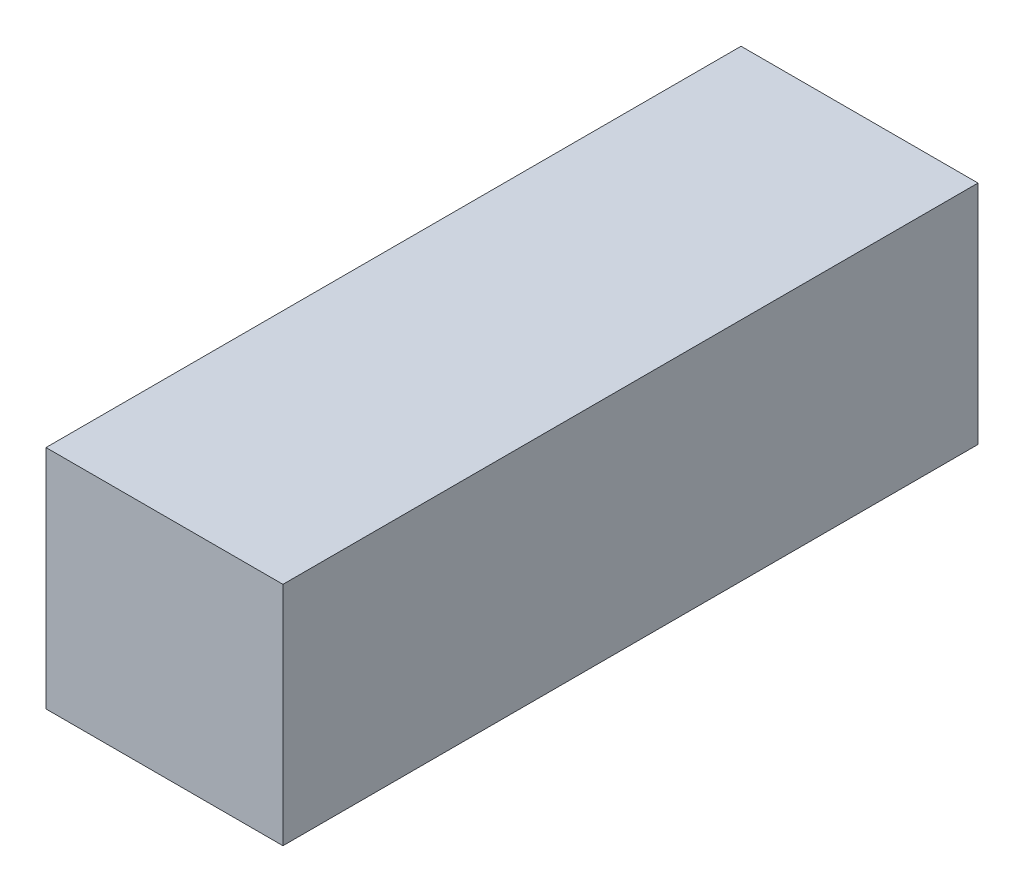
ISO-10303-21;
HEADER;
FILE_DESCRIPTION(('STEP AP214'),'2;1');
FILE_NAME('part.step','',(''),(''),'','','');
FILE_SCHEMA(('AUTOMOTIVE_DESIGN { 1 0 10303 214 1 1 1 1 }'));
ENDSEC;
DATA;
#1=APPLICATION_CONTEXT('core data for automotive mechanical design processes');
#2=APPLICATION_PROTOCOL_DEFINITION('international standard','automotive_design',2000,#1);
#3=PRODUCT_CONTEXT('',#1,'mechanical');
#4=PRODUCT('Part','Part','',(#3));
#5=PRODUCT_RELATED_PRODUCT_CATEGORY('part','',(#4));
#6=PRODUCT_DEFINITION_FORMATION('','',#4);
#7=PRODUCT_DEFINITION_CONTEXT('part definition',#1,'design');
#8=PRODUCT_DEFINITION('design','',#6,#7);
#9=PRODUCT_DEFINITION_SHAPE('','',#8);
#10=(LENGTH_UNIT() NAMED_UNIT(*) SI_UNIT(.MILLI.,.METRE.));
#11=(NAMED_UNIT(*) PLANE_ANGLE_UNIT() SI_UNIT($,.RADIAN.));
#12=(NAMED_UNIT(*) SI_UNIT($,.STERADIAN.) SOLID_ANGLE_UNIT());
#13=UNCERTAINTY_MEASURE_WITH_UNIT(LENGTH_MEASURE(1.E-05),#10,'distance_accuracy_value','');
#14=(GEOMETRIC_REPRESENTATION_CONTEXT(3) GLOBAL_UNCERTAINTY_ASSIGNED_CONTEXT((#13)) GLOBAL_UNIT_ASSIGNED_CONTEXT((#10,
#11,#12)) REPRESENTATION_CONTEXT('',''));
#15=CARTESIAN_POINT('',(0.,0.,0.));
#16=DIRECTION('',(0.,0.,1.));
#17=DIRECTION('',(1.,0.,0.));
#18=AXIS2_PLACEMENT_3D('',#15,#16,#17);
#19=CARTESIAN_POINT('',(-22.5,21.5,132.));
#20=DIRECTION('',(1.,0.,0.));
#21=DIRECTION('',(0.,1.,0.));
#22=AXIS2_PLACEMENT_3D('',#19,#20,#21);
#23=PLANE('',#22);
#24=DIRECTION('',(0.,-1.,0.));
#25=VECTOR('',#24,1.);
#26=CARTESIAN_POINT('',(-22.5,21.5,0.));
#27=LINE('',#26,#25);
#28=CARTESIAN_POINT('',(-22.5,21.5,0.));
#29=VERTEX_POINT('',#28);
#30=CARTESIAN_POINT('',(-22.5,-21.5,0.));
#31=VERTEX_POINT('',#30);
#32=EDGE_CURVE('E107',#29,#31,#27,.T.);
#33=ORIENTED_EDGE('',*,*,#32,.T.);
#34=DIRECTION('',(0.,0.,-1.));
#35=VECTOR('',#34,1.);
#36=CARTESIAN_POINT('',(-22.5,-21.5,132.));
#37=LINE('',#36,#35);
#38=CARTESIAN_POINT('',(-22.5,-21.5,132.));
#39=VERTEX_POINT('',#38);
#40=EDGE_CURVE('E11',#39,#31,#37,.T.);
#41=ORIENTED_EDGE('',*,*,#40,.F.);
#42=DIRECTION('',(0.,-1.,0.));
#43=VECTOR('',#42,1.);
#44=CARTESIAN_POINT('',(-22.5,21.5,132.));
#45=LINE('',#44,#43);
#46=CARTESIAN_POINT('',(-22.5,21.5,132.));
#47=VERTEX_POINT('',#46);
#48=EDGE_CURVE('E91',#47,#39,#45,.T.);
#49=ORIENTED_EDGE('',*,*,#48,.F.);
#50=DIRECTION('',(0.,0.,-1.));
#51=VECTOR('',#50,1.);
#52=CARTESIAN_POINT('',(-22.5,21.5,132.));
#53=LINE('',#52,#51);
#54=EDGE_CURVE('E103',#47,#29,#53,.T.);
#55=ORIENTED_EDGE('',*,*,#54,.T.);
#56=EDGE_LOOP('',(#33,#41,#49,#55));
#57=FACE_BOUND('',#56,.T.);
#58=ADVANCED_FACE('F39',(#57),#23,.F.);
#59=CARTESIAN_POINT('',(-22.5,-21.5,132.));
#60=DIRECTION('',(0.,1.,0.));
#61=DIRECTION('',(0.,0.,1.));
#62=AXIS2_PLACEMENT_3D('',#59,#60,#61);
#63=PLANE('',#62);
#64=DIRECTION('',(1.,0.,0.));
#65=VECTOR('',#64,1.);
#66=CARTESIAN_POINT('',(-22.5,-21.5,0.));
#67=LINE('',#66,#65);
#68=CARTESIAN_POINT('',(22.5,-21.5,0.));
#69=VERTEX_POINT('',#68);
#70=EDGE_CURVE('E96',#31,#69,#67,.T.);
#71=ORIENTED_EDGE('',*,*,#70,.T.);
#72=DIRECTION('',(0.,0.,-1.));
#73=VECTOR('',#72,1.);
#74=CARTESIAN_POINT('',(22.5,-21.5,132.));
#75=LINE('',#74,#73);
#76=CARTESIAN_POINT('',(22.5,-21.5,132.));
#77=VERTEX_POINT('',#76);
#78=EDGE_CURVE('E48',#77,#69,#75,.T.);
#79=ORIENTED_EDGE('',*,*,#78,.F.);
#80=DIRECTION('',(1.,0.,0.));
#81=VECTOR('',#80,1.);
#82=CARTESIAN_POINT('',(-22.5,-21.5,132.));
#83=LINE('',#82,#81);
#84=EDGE_CURVE('E86',#39,#77,#83,.T.);
#85=ORIENTED_EDGE('',*,*,#84,.F.);
#86=ORIENTED_EDGE('',*,*,#40,.T.);
#87=EDGE_LOOP('',(#71,#79,#85,#86));
#88=FACE_BOUND('',#87,.T.);
#89=ADVANCED_FACE('F95',(#88),#63,.F.);
#90=CARTESIAN_POINT('',(22.5,21.5,132.));
#91=DIRECTION('',(-1.,0.,0.));
#92=DIRECTION('',(0.,-1.,0.));
#93=AXIS2_PLACEMENT_3D('',#90,#91,#92);
#94=PLANE('',#93);
#95=DIRECTION('',(0.,1.,0.));
#96=VECTOR('',#95,1.);
#97=CARTESIAN_POINT('',(22.5,21.5,0.));
#98=LINE('',#97,#96);
#99=CARTESIAN_POINT('',(22.5,21.5,0.));
#100=VERTEX_POINT('',#99);
#101=EDGE_CURVE('E73',#69,#100,#98,.T.);
#102=ORIENTED_EDGE('',*,*,#101,.T.);
#103=DIRECTION('',(0.,0.,-1.));
#104=VECTOR('',#103,1.);
#105=CARTESIAN_POINT('',(22.5,21.5,132.));
#106=LINE('',#105,#104);
#107=CARTESIAN_POINT('',(22.5,21.5,132.));
#108=VERTEX_POINT('',#107);
#109=EDGE_CURVE('E98',#108,#100,#106,.T.);
#110=ORIENTED_EDGE('',*,*,#109,.F.);
#111=DIRECTION('',(0.,1.,0.));
#112=VECTOR('',#111,1.);
#113=CARTESIAN_POINT('',(22.5,21.5,132.));
#114=LINE('',#113,#112);
#115=EDGE_CURVE('E89',#77,#108,#114,.T.);
#116=ORIENTED_EDGE('',*,*,#115,.F.);
#117=ORIENTED_EDGE('',*,*,#78,.T.);
#118=EDGE_LOOP('',(#102,#110,#116,#117));
#119=FACE_BOUND('',#118,.T.);
#120=ADVANCED_FACE('F99',(#119),#94,.F.);
#121=CARTESIAN_POINT('',(-22.5,21.5,132.));
#122=DIRECTION('',(0.,-1.,0.));
#123=DIRECTION('',(1.,0.,0.));
#124=AXIS2_PLACEMENT_3D('',#121,#122,#123);
#125=PLANE('',#124);
#126=DIRECTION('',(-1.,0.,0.));
#127=VECTOR('',#126,1.);
#128=CARTESIAN_POINT('',(-22.5,21.5,0.));
#129=LINE('',#128,#127);
#130=EDGE_CURVE('E79',#100,#29,#129,.T.);
#131=ORIENTED_EDGE('',*,*,#130,.T.);
#132=ORIENTED_EDGE('',*,*,#54,.F.);
#133=DIRECTION('',(-1.,0.,0.));
#134=VECTOR('',#133,1.);
#135=CARTESIAN_POINT('',(-22.5,21.5,132.));
#136=LINE('',#135,#134);
#137=EDGE_CURVE('E56',#108,#47,#136,.T.);
#138=ORIENTED_EDGE('',*,*,#137,.F.);
#139=ORIENTED_EDGE('',*,*,#109,.T.);
#140=EDGE_LOOP('',(#131,#132,#138,#139));
#141=FACE_BOUND('',#140,.T.);
#142=ADVANCED_FACE('F120',(#141),#125,.F.);
#143=CARTESIAN_POINT('',(0.,0.,132.));
#144=DIRECTION('',(0.,0.,1.));
#145=DIRECTION('',(1.,0.,0.));
#146=AXIS2_PLACEMENT_3D('',#143,#144,#145);
#147=PLANE('',#146);
#148=ORIENTED_EDGE('',*,*,#48,.T.);
#149=ORIENTED_EDGE('',*,*,#84,.T.);
#150=ORIENTED_EDGE('',*,*,#115,.T.);
#151=ORIENTED_EDGE('',*,*,#137,.T.);
#152=EDGE_LOOP('',(#148,#149,#150,#151));
#153=FACE_BOUND('',#152,.T.);
#154=ADVANCED_FACE('F87',(#153),#147,.T.);
#155=CARTESIAN_POINT('',(0.,0.,0.));
#156=DIRECTION('',(0.,0.,1.));
#157=DIRECTION('',(1.,0.,0.));
#158=AXIS2_PLACEMENT_3D('',#155,#156,#157);
#159=PLANE('',#158);
#160=ORIENTED_EDGE('',*,*,#32,.F.);
#161=ORIENTED_EDGE('',*,*,#130,.F.);
#162=ORIENTED_EDGE('',*,*,#101,.F.);
#163=ORIENTED_EDGE('',*,*,#70,.F.);
#164=EDGE_LOOP('',(#160,#161,#162,#163));
#165=FACE_BOUND('',#164,.T.);
#166=ADVANCED_FACE('F123',(#165),#159,.F.);
#167=CLOSED_SHELL('',(#58,#89,#120,#142,#154,#166));
#168=MANIFOLD_SOLID_BREP('B2',#167);
#169=ADVANCED_BREP_SHAPE_REPRESENTATION('',(#18,#168),#14);
#170=SHAPE_DEFINITION_REPRESENTATION(#9,#169);
ENDSEC;
END-ISO-10303-21;
